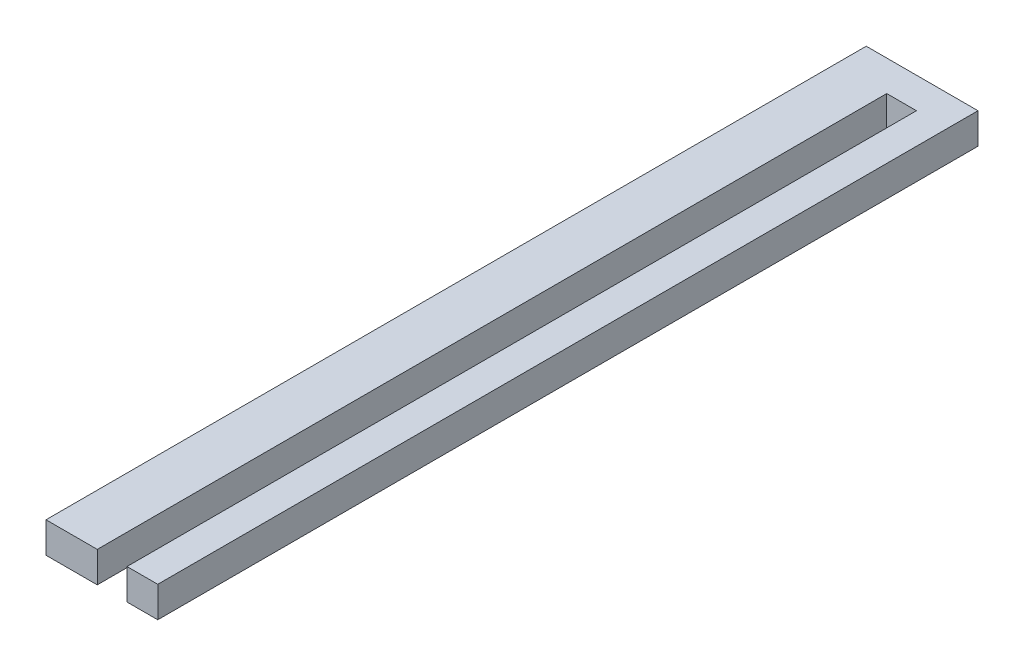
ISO-10303-21;
HEADER;
FILE_DESCRIPTION(('STEP AP214'),'2;1');
FILE_NAME('part.step','',(''),(''),'','','');
FILE_SCHEMA(('AUTOMOTIVE_DESIGN { 1 0 10303 214 1 1 1 1 }'));
ENDSEC;
DATA;
#1=APPLICATION_CONTEXT('core data for automotive mechanical design processes');
#2=APPLICATION_PROTOCOL_DEFINITION('international standard','automotive_design',2000,#1);
#3=PRODUCT_CONTEXT('',#1,'mechanical');
#4=PRODUCT('Part','Part','',(#3));
#5=PRODUCT_RELATED_PRODUCT_CATEGORY('part','',(#4));
#6=PRODUCT_DEFINITION_FORMATION('','',#4);
#7=PRODUCT_DEFINITION_CONTEXT('part definition',#1,'design');
#8=PRODUCT_DEFINITION('design','',#6,#7);
#9=PRODUCT_DEFINITION_SHAPE('','',#8);
#10=(LENGTH_UNIT() NAMED_UNIT(*) SI_UNIT(.MILLI.,.METRE.));
#11=(NAMED_UNIT(*) PLANE_ANGLE_UNIT() SI_UNIT($,.RADIAN.));
#12=(NAMED_UNIT(*) SI_UNIT($,.STERADIAN.) SOLID_ANGLE_UNIT());
#13=UNCERTAINTY_MEASURE_WITH_UNIT(LENGTH_MEASURE(1.E-05),#10,'distance_accuracy_value','');
#14=(GEOMETRIC_REPRESENTATION_CONTEXT(3) GLOBAL_UNCERTAINTY_ASSIGNED_CONTEXT((#13)) GLOBAL_UNIT_ASSIGNED_CONTEXT((#10,
#11,#12)) REPRESENTATION_CONTEXT('',''));
#15=CARTESIAN_POINT('',(0.,0.,0.));
#16=DIRECTION('',(0.,0.,1.));
#17=DIRECTION('',(1.,0.,0.));
#18=AXIS2_PLACEMENT_3D('',#15,#16,#17);
#19=CARTESIAN_POINT('',(5.,3.,0.));
#20=DIRECTION('',(0.,0.,-1.));
#21=DIRECTION('',(-1.,0.,0.));
#22=AXIS2_PLACEMENT_3D('',#19,#20,#21);
#23=PLANE('',#22);
#24=DIRECTION('',(1.,0.,0.));
#25=VECTOR('',#24,1.);
#26=CARTESIAN_POINT('',(5.,0.,0.));
#27=LINE('',#26,#25);
#28=CARTESIAN_POINT('',(0.,0.,0.));
#29=VERTEX_POINT('',#28);
#30=CARTESIAN_POINT('',(5.,0.,0.));
#31=VERTEX_POINT('',#30);
#32=EDGE_CURVE('E135',#29,#31,#27,.T.);
#33=ORIENTED_EDGE('',*,*,#32,.T.);
#34=DIRECTION('',(0.,-1.,0.));
#35=VECTOR('',#34,1.);
#36=CARTESIAN_POINT('',(5.,3.,0.));
#37=LINE('',#36,#35);
#38=CARTESIAN_POINT('',(5.,3.,0.));
#39=VERTEX_POINT('',#38);
#40=EDGE_CURVE('E11',#39,#31,#37,.T.);
#41=ORIENTED_EDGE('',*,*,#40,.F.);
#42=DIRECTION('',(1.,0.,0.));
#43=VECTOR('',#42,1.);
#44=CARTESIAN_POINT('',(5.,3.,0.));
#45=LINE('',#44,#43);
#46=CARTESIAN_POINT('',(0.,3.,0.));
#47=VERTEX_POINT('',#46);
#48=EDGE_CURVE('E149',#47,#39,#45,.T.);
#49=ORIENTED_EDGE('',*,*,#48,.F.);
#50=DIRECTION('',(0.,-1.,0.));
#51=VECTOR('',#50,1.);
#52=CARTESIAN_POINT('',(0.,3.,0.));
#53=LINE('',#52,#51);
#54=EDGE_CURVE('E131',#47,#29,#53,.T.);
#55=ORIENTED_EDGE('',*,*,#54,.T.);
#56=EDGE_LOOP('',(#33,#41,#49,#55));
#57=FACE_BOUND('',#56,.T.);
#58=ADVANCED_FACE('F39',(#57),#23,.F.);
#59=CARTESIAN_POINT('',(5.,3.,-77.));
#60=DIRECTION('',(-1.,0.,0.));
#61=DIRECTION('',(0.,0.,1.));
#62=AXIS2_PLACEMENT_3D('',#59,#60,#61);
#63=PLANE('',#62);
#64=DIRECTION('',(0.,0.,-1.));
#65=VECTOR('',#64,1.);
#66=CARTESIAN_POINT('',(5.,0.,-77.));
#67=LINE('',#66,#65);
#68=CARTESIAN_POINT('',(5.,0.,-77.));
#69=VERTEX_POINT('',#68);
#70=EDGE_CURVE('E138',#31,#69,#67,.T.);
#71=ORIENTED_EDGE('',*,*,#70,.T.);
#72=DIRECTION('',(0.,-1.,0.));
#73=VECTOR('',#72,1.);
#74=CARTESIAN_POINT('',(5.,3.,-77.));
#75=LINE('',#74,#73);
#76=CARTESIAN_POINT('',(5.,3.,-77.));
#77=VERTEX_POINT('',#76);
#78=EDGE_CURVE('E47',#77,#69,#75,.T.);
#79=ORIENTED_EDGE('',*,*,#78,.F.);
#80=DIRECTION('',(0.,0.,-1.));
#81=VECTOR('',#80,1.);
#82=CARTESIAN_POINT('',(5.,3.,-77.));
#83=LINE('',#82,#81);
#84=EDGE_CURVE('E98',#39,#77,#83,.T.);
#85=ORIENTED_EDGE('',*,*,#84,.F.);
#86=ORIENTED_EDGE('',*,*,#40,.T.);
#87=EDGE_LOOP('',(#71,#79,#85,#86));
#88=FACE_BOUND('',#87,.T.);
#89=ADVANCED_FACE('F184',(#88),#63,.F.);
#90=CARTESIAN_POINT('',(7.90000000000001,3.,-77.));
#91=DIRECTION('',(0.,0.,-1.));
#92=DIRECTION('',(-1.,0.,0.));
#93=AXIS2_PLACEMENT_3D('',#90,#91,#92);
#94=PLANE('',#93);
#95=DIRECTION('',(1.,0.,0.));
#96=VECTOR('',#95,1.);
#97=CARTESIAN_POINT('',(7.90000000000001,0.,-77.));
#98=LINE('',#97,#96);
#99=CARTESIAN_POINT('',(7.90000000000001,0.,-77.));
#100=VERTEX_POINT('',#99);
#101=EDGE_CURVE('E140',#69,#100,#98,.T.);
#102=ORIENTED_EDGE('',*,*,#101,.T.);
#103=DIRECTION('',(0.,-1.,0.));
#104=VECTOR('',#103,1.);
#105=CARTESIAN_POINT('',(7.90000000000001,3.,-77.));
#106=LINE('',#105,#104);
#107=CARTESIAN_POINT('',(7.90000000000001,3.,-77.));
#108=VERTEX_POINT('',#107);
#109=EDGE_CURVE('E156',#108,#100,#106,.T.);
#110=ORIENTED_EDGE('',*,*,#109,.F.);
#111=DIRECTION('',(1.,0.,0.));
#112=VECTOR('',#111,1.);
#113=CARTESIAN_POINT('',(7.90000000000001,3.,-77.));
#114=LINE('',#113,#112);
#115=EDGE_CURVE('E164',#77,#108,#114,.T.);
#116=ORIENTED_EDGE('',*,*,#115,.F.);
#117=ORIENTED_EDGE('',*,*,#78,.T.);
#118=EDGE_LOOP('',(#102,#110,#116,#117));
#119=FACE_BOUND('',#118,.T.);
#120=ADVANCED_FACE('F162',(#119),#94,.F.);
#121=CARTESIAN_POINT('',(7.9,3.,0.));
#122=DIRECTION('',(1.,0.,0.));
#123=DIRECTION('',(0.,0.,-1.));
#124=AXIS2_PLACEMENT_3D('',#121,#122,#123);
#125=PLANE('',#124);
#126=DIRECTION('',(0.,0.,1.));
#127=VECTOR('',#126,1.);
#128=CARTESIAN_POINT('',(7.9,0.,0.));
#129=LINE('',#128,#127);
#130=CARTESIAN_POINT('',(7.9,0.,0.));
#131=VERTEX_POINT('',#130);
#132=EDGE_CURVE('E142',#100,#131,#129,.T.);
#133=ORIENTED_EDGE('',*,*,#132,.T.);
#134=DIRECTION('',(0.,-1.,0.));
#135=VECTOR('',#134,1.);
#136=CARTESIAN_POINT('',(7.9,3.,0.));
#137=LINE('',#136,#135);
#138=CARTESIAN_POINT('',(7.9,3.,0.));
#139=VERTEX_POINT('',#138);
#140=EDGE_CURVE('E153',#139,#131,#137,.T.);
#141=ORIENTED_EDGE('',*,*,#140,.F.);
#142=DIRECTION('',(0.,0.,1.));
#143=VECTOR('',#142,1.);
#144=CARTESIAN_POINT('',(7.9,3.,0.));
#145=LINE('',#144,#143);
#146=EDGE_CURVE('E176',#108,#139,#145,.T.);
#147=ORIENTED_EDGE('',*,*,#146,.F.);
#148=ORIENTED_EDGE('',*,*,#109,.T.);
#149=EDGE_LOOP('',(#133,#141,#147,#148));
#150=FACE_BOUND('',#149,.T.);
#151=ADVANCED_FACE('F172',(#150),#125,.F.);
#152=CARTESIAN_POINT('',(10.9,3.,0.));
#153=DIRECTION('',(0.,0.,-1.));
#154=DIRECTION('',(-1.,0.,0.));
#155=AXIS2_PLACEMENT_3D('',#152,#153,#154);
#156=PLANE('',#155);
#157=DIRECTION('',(1.,0.,0.));
#158=VECTOR('',#157,1.);
#159=CARTESIAN_POINT('',(10.9,0.,0.));
#160=LINE('',#159,#158);
#161=CARTESIAN_POINT('',(10.9,0.,0.));
#162=VERTEX_POINT('',#161);
#163=EDGE_CURVE('E144',#131,#162,#160,.T.);
#164=ORIENTED_EDGE('',*,*,#163,.T.);
#165=DIRECTION('',(0.,-1.,0.));
#166=VECTOR('',#165,1.);
#167=CARTESIAN_POINT('',(10.9,3.,0.));
#168=LINE('',#167,#166);
#169=CARTESIAN_POINT('',(10.9,3.,0.));
#170=VERTEX_POINT('',#169);
#171=EDGE_CURVE('E126',#170,#162,#168,.T.);
#172=ORIENTED_EDGE('',*,*,#171,.F.);
#173=DIRECTION('',(1.,0.,0.));
#174=VECTOR('',#173,1.);
#175=CARTESIAN_POINT('',(10.9,3.,0.));
#176=LINE('',#175,#174);
#177=EDGE_CURVE('E117',#139,#170,#176,.T.);
#178=ORIENTED_EDGE('',*,*,#177,.F.);
#179=ORIENTED_EDGE('',*,*,#140,.T.);
#180=EDGE_LOOP('',(#164,#172,#178,#179));
#181=FACE_BOUND('',#180,.T.);
#182=ADVANCED_FACE('F175',(#181),#156,.F.);
#183=CARTESIAN_POINT('',(10.9,3.,-80.));
#184=DIRECTION('',(-1.,0.,0.));
#185=DIRECTION('',(0.,0.,1.));
#186=AXIS2_PLACEMENT_3D('',#183,#184,#185);
#187=PLANE('',#186);
#188=DIRECTION('',(0.,0.,-1.));
#189=VECTOR('',#188,1.);
#190=CARTESIAN_POINT('',(10.9,0.,-80.));
#191=LINE('',#190,#189);
#192=CARTESIAN_POINT('',(10.9,0.,-80.));
#193=VERTEX_POINT('',#192);
#194=EDGE_CURVE('E125',#162,#193,#191,.T.);
#195=ORIENTED_EDGE('',*,*,#194,.T.);
#196=DIRECTION('',(0.,-1.,0.));
#197=VECTOR('',#196,1.);
#198=CARTESIAN_POINT('',(10.9,3.,-80.));
#199=LINE('',#198,#197);
#200=CARTESIAN_POINT('',(10.9,3.,-80.));
#201=VERTEX_POINT('',#200);
#202=EDGE_CURVE('E122',#201,#193,#199,.T.);
#203=ORIENTED_EDGE('',*,*,#202,.F.);
#204=DIRECTION('',(0.,0.,-1.));
#205=VECTOR('',#204,1.);
#206=CARTESIAN_POINT('',(10.9,3.,-80.));
#207=LINE('',#206,#205);
#208=EDGE_CURVE('E111',#170,#201,#207,.T.);
#209=ORIENTED_EDGE('',*,*,#208,.F.);
#210=ORIENTED_EDGE('',*,*,#171,.T.);
#211=EDGE_LOOP('',(#195,#203,#209,#210));
#212=FACE_BOUND('',#211,.T.);
#213=ADVANCED_FACE('F123',(#212),#187,.F.);
#214=CARTESIAN_POINT('',(0.,3.,-80.));
#215=DIRECTION('',(0.,0.,1.));
#216=DIRECTION('',(1.,0.,0.));
#217=AXIS2_PLACEMENT_3D('',#214,#215,#216);
#218=PLANE('',#217);
#219=DIRECTION('',(-1.,0.,0.));
#220=VECTOR('',#219,1.);
#221=CARTESIAN_POINT('',(0.,0.,-80.));
#222=LINE('',#221,#220);
#223=CARTESIAN_POINT('',(0.,0.,-80.));
#224=VERTEX_POINT('',#223);
#225=EDGE_CURVE('E84',#193,#224,#222,.T.);
#226=ORIENTED_EDGE('',*,*,#225,.T.);
#227=DIRECTION('',(0.,-1.,0.));
#228=VECTOR('',#227,1.);
#229=CARTESIAN_POINT('',(0.,3.,-80.));
#230=LINE('',#229,#228);
#231=CARTESIAN_POINT('',(0.,3.,-80.));
#232=VERTEX_POINT('',#231);
#233=EDGE_CURVE('E127',#232,#224,#230,.T.);
#234=ORIENTED_EDGE('',*,*,#233,.F.);
#235=DIRECTION('',(-1.,0.,0.));
#236=VECTOR('',#235,1.);
#237=CARTESIAN_POINT('',(0.,3.,-80.));
#238=LINE('',#237,#236);
#239=EDGE_CURVE('E115',#201,#232,#238,.T.);
#240=ORIENTED_EDGE('',*,*,#239,.F.);
#241=ORIENTED_EDGE('',*,*,#202,.T.);
#242=EDGE_LOOP('',(#226,#234,#240,#241));
#243=FACE_BOUND('',#242,.T.);
#244=ADVANCED_FACE('F129',(#243),#218,.F.);
#245=CARTESIAN_POINT('',(0.,3.,0.));
#246=DIRECTION('',(1.,0.,0.));
#247=DIRECTION('',(0.,0.,-1.));
#248=AXIS2_PLACEMENT_3D('',#245,#246,#247);
#249=PLANE('',#248);
#250=DIRECTION('',(0.,0.,1.));
#251=VECTOR('',#250,1.);
#252=CARTESIAN_POINT('',(0.,0.,0.));
#253=LINE('',#252,#251);
#254=EDGE_CURVE('E90',#224,#29,#253,.T.);
#255=ORIENTED_EDGE('',*,*,#254,.T.);
#256=ORIENTED_EDGE('',*,*,#54,.F.);
#257=DIRECTION('',(0.,0.,1.));
#258=VECTOR('',#257,1.);
#259=CARTESIAN_POINT('',(0.,3.,0.));
#260=LINE('',#259,#258);
#261=EDGE_CURVE('E55',#232,#47,#260,.T.);
#262=ORIENTED_EDGE('',*,*,#261,.F.);
#263=ORIENTED_EDGE('',*,*,#233,.T.);
#264=EDGE_LOOP('',(#255,#256,#262,#263));
#265=FACE_BOUND('',#264,.T.);
#266=ADVANCED_FACE('F200',(#265),#249,.F.);
#267=CARTESIAN_POINT('',(0.,3.,0.));
#268=DIRECTION('',(0.,-1.,0.));
#269=DIRECTION('',(0.,0.,-1.));
#270=AXIS2_PLACEMENT_3D('',#267,#268,#269);
#271=PLANE('',#270);
#272=ORIENTED_EDGE('',*,*,#48,.T.);
#273=ORIENTED_EDGE('',*,*,#84,.T.);
#274=ORIENTED_EDGE('',*,*,#115,.T.);
#275=ORIENTED_EDGE('',*,*,#146,.T.);
#276=ORIENTED_EDGE('',*,*,#177,.T.);
#277=ORIENTED_EDGE('',*,*,#208,.T.);
#278=ORIENTED_EDGE('',*,*,#239,.T.);
#279=ORIENTED_EDGE('',*,*,#261,.T.);
#280=EDGE_LOOP('',(#272,#273,#274,#275,#276,#277,#278,#279));
#281=FACE_BOUND('',#280,.T.);
#282=ADVANCED_FACE('F113',(#281),#271,.F.);
#283=CARTESIAN_POINT('',(0.,0.,0.));
#284=DIRECTION('',(0.,-1.,0.));
#285=DIRECTION('',(0.,0.,-1.));
#286=AXIS2_PLACEMENT_3D('',#283,#284,#285);
#287=PLANE('',#286);
#288=ORIENTED_EDGE('',*,*,#32,.F.);
#289=ORIENTED_EDGE('',*,*,#254,.F.);
#290=ORIENTED_EDGE('',*,*,#225,.F.);
#291=ORIENTED_EDGE('',*,*,#194,.F.);
#292=ORIENTED_EDGE('',*,*,#163,.F.);
#293=ORIENTED_EDGE('',*,*,#132,.F.);
#294=ORIENTED_EDGE('',*,*,#101,.F.);
#295=ORIENTED_EDGE('',*,*,#70,.F.);
#296=EDGE_LOOP('',(#288,#289,#290,#291,#292,#293,#294,#295));
#297=FACE_BOUND('',#296,.T.);
#298=ADVANCED_FACE('F168',(#297),#287,.T.);
#299=CLOSED_SHELL('',(#58,#89,#120,#151,#182,#213,#244,#266,#282,#298));
#300=MANIFOLD_SOLID_BREP('B2',#299);
#301=ADVANCED_BREP_SHAPE_REPRESENTATION('',(#18,#300),#14);
#302=SHAPE_DEFINITION_REPRESENTATION(#9,#301);
ENDSEC;
END-ISO-10303-21;
